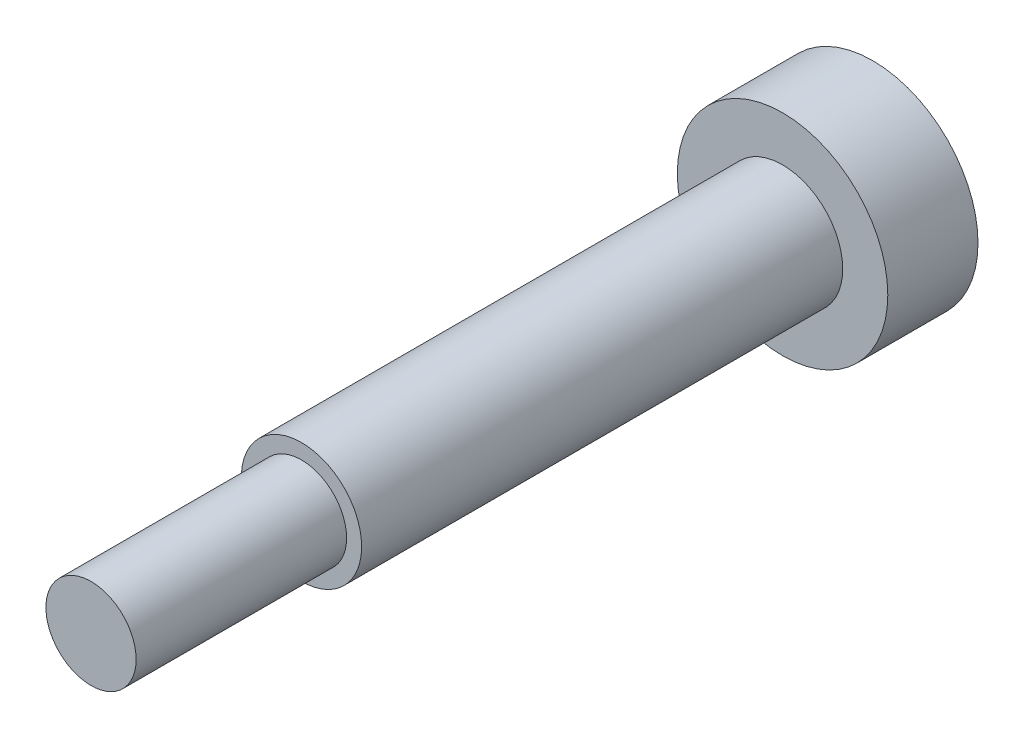
ISO-10303-21;
HEADER;
FILE_DESCRIPTION(('STEP AP214'),'2;1');
FILE_NAME('part.step','',(''),(''),'','','');
FILE_SCHEMA(('AUTOMOTIVE_DESIGN { 1 0 10303 214 1 1 1 1 }'));
ENDSEC;
DATA;
#1=APPLICATION_CONTEXT('core data for automotive mechanical design processes');
#2=APPLICATION_PROTOCOL_DEFINITION('international standard','automotive_design',2000,#1);
#3=PRODUCT_CONTEXT('',#1,'mechanical');
#4=PRODUCT('Part','Part','',(#3));
#5=PRODUCT_RELATED_PRODUCT_CATEGORY('part','',(#4));
#6=PRODUCT_DEFINITION_FORMATION('','',#4);
#7=PRODUCT_DEFINITION_CONTEXT('part definition',#1,'design');
#8=PRODUCT_DEFINITION('design','',#6,#7);
#9=PRODUCT_DEFINITION_SHAPE('','',#8);
#10=(LENGTH_UNIT() NAMED_UNIT(*) SI_UNIT(.MILLI.,.METRE.));
#11=(NAMED_UNIT(*) PLANE_ANGLE_UNIT() SI_UNIT($,.RADIAN.));
#12=(NAMED_UNIT(*) SI_UNIT($,.STERADIAN.) SOLID_ANGLE_UNIT());
#13=UNCERTAINTY_MEASURE_WITH_UNIT(LENGTH_MEASURE(1.E-05),#10,'distance_accuracy_value','');
#14=(GEOMETRIC_REPRESENTATION_CONTEXT(3) GLOBAL_UNCERTAINTY_ASSIGNED_CONTEXT((#13)) GLOBAL_UNIT_ASSIGNED_CONTEXT((#10,
#11,#12)) REPRESENTATION_CONTEXT('',''));
#15=CARTESIAN_POINT('',(0.,0.,0.));
#16=DIRECTION('',(0.,0.,1.));
#17=DIRECTION('',(1.,0.,0.));
#18=AXIS2_PLACEMENT_3D('',#15,#16,#17);
#19=CARTESIAN_POINT('',(0.,0.,-3.));
#20=DIRECTION('',(0.,0.,1.));
#21=DIRECTION('',(1.,0.,0.));
#22=AXIS2_PLACEMENT_3D('',#19,#20,#21);
#23=PLANE('',#22);
#24=CARTESIAN_POINT('',(0.,0.,-3.));
#25=DIRECTION('',(0.,0.,1.));
#26=DIRECTION('',(1.,0.,0.));
#27=AXIS2_PLACEMENT_3D('',#24,#25,#26);
#28=CIRCLE('',#27,3.5);
#29=CARTESIAN_POINT('',(3.5,0.,-3.));
#30=VERTEX_POINT('',#29);
#31=EDGE_CURVE('E122',#30,#30,#28,.T.);
#32=ORIENTED_EDGE('',*,*,#31,.F.);
#33=EDGE_LOOP('',(#32));
#34=FACE_BOUND('',#33,.T.);
#35=DIRECTION('',(-0.5,-0.866025403784439,0.));
#36=VECTOR('',#35,1.);
#37=CARTESIAN_POINT('',(0.866025403784439,-0.5,-3.));
#38=LINE('',#37,#36);
#39=CARTESIAN_POINT('',(1.15470053837925,0.,-3.));
#40=VERTEX_POINT('',#39);
#41=CARTESIAN_POINT('',(0.577350269189626,-1.,-3.));
#42=VERTEX_POINT('',#41);
#43=EDGE_CURVE('E11',#40,#42,#38,.T.);
#44=ORIENTED_EDGE('',*,*,#43,.F.);
#45=DIRECTION('',(0.5,-0.866025403784439,0.));
#46=VECTOR('',#45,1.);
#47=CARTESIAN_POINT('',(0.866025403784439,0.5,-3.));
#48=LINE('',#47,#46);
#49=CARTESIAN_POINT('',(0.577350269189626,1.,-3.));
#50=VERTEX_POINT('',#49);
#51=EDGE_CURVE('E50',#50,#40,#48,.T.);
#52=ORIENTED_EDGE('',*,*,#51,.F.);
#53=DIRECTION('',(1.,0.,0.));
#54=VECTOR('',#53,1.);
#55=CARTESIAN_POINT('',(0.,1.,-3.));
#56=LINE('',#55,#54);
#57=CARTESIAN_POINT('',(-0.577350269189626,1.,-3.));
#58=VERTEX_POINT('',#57);
#59=EDGE_CURVE('E140',#58,#50,#56,.T.);
#60=ORIENTED_EDGE('',*,*,#59,.F.);
#61=DIRECTION('',(0.5,0.866025403784438,0.));
#62=VECTOR('',#61,1.);
#63=CARTESIAN_POINT('',(-0.866025403784439,0.5,-3.));
#64=LINE('',#63,#62);
#65=CARTESIAN_POINT('',(-1.15470053837925,0.,-3.));
#66=VERTEX_POINT('',#65);
#67=EDGE_CURVE('E135',#66,#58,#64,.T.);
#68=ORIENTED_EDGE('',*,*,#67,.F.);
#69=DIRECTION('',(-0.5,0.866025403784439,0.));
#70=VECTOR('',#69,1.);
#71=CARTESIAN_POINT('',(-0.866025403784439,-0.5,-3.));
#72=LINE('',#71,#70);
#73=CARTESIAN_POINT('',(-0.577350269189626,-1.,-3.));
#74=VERTEX_POINT('',#73);
#75=EDGE_CURVE('E134',#74,#66,#72,.T.);
#76=ORIENTED_EDGE('',*,*,#75,.F.);
#77=DIRECTION('',(-1.,0.,0.));
#78=VECTOR('',#77,1.);
#79=CARTESIAN_POINT('',(0.,-1.,-3.));
#80=LINE('',#79,#78);
#81=EDGE_CURVE('E120',#42,#74,#80,.T.);
#82=ORIENTED_EDGE('',*,*,#81,.F.);
#83=EDGE_LOOP('',(#44,#52,#60,#68,#76,#82));
#84=FACE_BOUND('',#83,.T.);
#85=ADVANCED_FACE('F39',(#34,#84),#23,.F.);
#86=CARTESIAN_POINT('',(0.,0.,0.));
#87=DIRECTION('',(0.,0.,-1.));
#88=DIRECTION('',(-1.,0.,0.));
#89=AXIS2_PLACEMENT_3D('',#86,#87,#88);
#90=CYLINDRICAL_SURFACE('',#89,3.5);
#91=CARTESIAN_POINT('',(0.,0.,0.));
#92=DIRECTION('',(0.,0.,1.));
#93=DIRECTION('',(1.,0.,0.));
#94=AXIS2_PLACEMENT_3D('',#91,#92,#93);
#95=CIRCLE('',#94,3.5);
#96=CARTESIAN_POINT('',(3.5,0.,0.));
#97=VERTEX_POINT('',#96);
#98=EDGE_CURVE('E130',#97,#97,#95,.T.);
#99=ORIENTED_EDGE('',*,*,#98,.F.);
#100=EDGE_LOOP('',(#99));
#101=FACE_BOUND('',#100,.T.);
#102=ORIENTED_EDGE('',*,*,#31,.T.);
#103=EDGE_LOOP('',(#102));
#104=FACE_BOUND('',#103,.T.);
#105=ADVANCED_FACE('F41',(#101,#104),#90,.T.);
#106=CARTESIAN_POINT('',(0.,0.,0.));
#107=DIRECTION('',(0.,0.,1.));
#108=DIRECTION('',(1.,0.,0.));
#109=AXIS2_PLACEMENT_3D('',#106,#107,#108);
#110=PLANE('',#109);
#111=CARTESIAN_POINT('',(0.,0.,0.));
#112=DIRECTION('',(0.,0.,1.));
#113=DIRECTION('',(1.,0.,0.));
#114=AXIS2_PLACEMENT_3D('',#111,#112,#113);
#115=CIRCLE('',#114,2.);
#116=CARTESIAN_POINT('',(2.,0.,0.));
#117=VERTEX_POINT('',#116);
#118=EDGE_CURVE('E123',#117,#117,#115,.T.);
#119=ORIENTED_EDGE('',*,*,#118,.F.);
#120=EDGE_LOOP('',(#119));
#121=FACE_BOUND('',#120,.T.);
#122=ORIENTED_EDGE('',*,*,#98,.T.);
#123=EDGE_LOOP('',(#122));
#124=FACE_BOUND('',#123,.T.);
#125=ADVANCED_FACE('F184',(#121,#124),#110,.T.);
#126=CARTESIAN_POINT('',(0.,0.,16.));
#127=DIRECTION('',(0.,0.,-1.));
#128=DIRECTION('',(-1.,0.,0.));
#129=AXIS2_PLACEMENT_3D('',#126,#127,#128);
#130=CYLINDRICAL_SURFACE('',#129,2.);
#131=CARTESIAN_POINT('',(0.,0.,16.));
#132=DIRECTION('',(0.,0.,1.));
#133=DIRECTION('',(1.,0.,0.));
#134=AXIS2_PLACEMENT_3D('',#131,#132,#133);
#135=CIRCLE('',#134,2.);
#136=CARTESIAN_POINT('',(2.,0.,16.));
#137=VERTEX_POINT('',#136);
#138=EDGE_CURVE('E112',#137,#137,#135,.T.);
#139=ORIENTED_EDGE('',*,*,#138,.F.);
#140=EDGE_LOOP('',(#139));
#141=FACE_BOUND('',#140,.T.);
#142=ORIENTED_EDGE('',*,*,#118,.T.);
#143=EDGE_LOOP('',(#142));
#144=FACE_BOUND('',#143,.T.);
#145=ADVANCED_FACE('F190',(#141,#144),#130,.T.);
#146=CARTESIAN_POINT('',(0.,0.,16.));
#147=DIRECTION('',(0.,0.,1.));
#148=DIRECTION('',(1.,0.,0.));
#149=AXIS2_PLACEMENT_3D('',#146,#147,#148);
#150=PLANE('',#149);
#151=CARTESIAN_POINT('',(0.,0.,16.));
#152=DIRECTION('',(0.,0.,1.));
#153=DIRECTION('',(1.,0.,0.));
#154=AXIS2_PLACEMENT_3D('',#151,#152,#153);
#155=CIRCLE('',#154,1.5);
#156=CARTESIAN_POINT('',(1.5,0.,16.));
#157=VERTEX_POINT('',#156);
#158=EDGE_CURVE('E117',#157,#157,#155,.T.);
#159=ORIENTED_EDGE('',*,*,#158,.F.);
#160=EDGE_LOOP('',(#159));
#161=FACE_BOUND('',#160,.T.);
#162=ORIENTED_EDGE('',*,*,#138,.T.);
#163=EDGE_LOOP('',(#162));
#164=FACE_BOUND('',#163,.T.);
#165=ADVANCED_FACE('F192',(#161,#164),#150,.T.);
#166=CARTESIAN_POINT('',(0.,0.,23.));
#167=DIRECTION('',(0.,0.,-1.));
#168=DIRECTION('',(-1.,0.,0.));
#169=AXIS2_PLACEMENT_3D('',#166,#167,#168);
#170=CYLINDRICAL_SURFACE('',#169,1.5);
#171=CARTESIAN_POINT('',(0.,0.,23.));
#172=DIRECTION('',(0.,0.,1.));
#173=DIRECTION('',(1.,0.,0.));
#174=AXIS2_PLACEMENT_3D('',#171,#172,#173);
#175=CIRCLE('',#174,1.5);
#176=CARTESIAN_POINT('',(1.5,0.,23.));
#177=VERTEX_POINT('',#176);
#178=EDGE_CURVE('E110',#177,#177,#175,.T.);
#179=ORIENTED_EDGE('',*,*,#178,.F.);
#180=EDGE_LOOP('',(#179));
#181=FACE_BOUND('',#180,.T.);
#182=ORIENTED_EDGE('',*,*,#158,.T.);
#183=EDGE_LOOP('',(#182));
#184=FACE_BOUND('',#183,.T.);
#185=ADVANCED_FACE('F196',(#181,#184),#170,.T.);
#186=CARTESIAN_POINT('',(0.,0.,23.));
#187=DIRECTION('',(0.,0.,1.));
#188=DIRECTION('',(1.,0.,0.));
#189=AXIS2_PLACEMENT_3D('',#186,#187,#188);
#190=PLANE('',#189);
#191=ORIENTED_EDGE('',*,*,#178,.T.);
#192=EDGE_LOOP('',(#191));
#193=FACE_BOUND('',#192,.T.);
#194=ADVANCED_FACE('F205',(#193),#190,.T.);
#195=CARTESIAN_POINT('',(0.577350269189626,-1.,-0.96));
#196=DIRECTION('',(-0.866025403784439,0.5,0.));
#197=DIRECTION('',(-0.5,-0.866025403784439,0.));
#198=AXIS2_PLACEMENT_3D('',#195,#196,#197);
#199=PLANE('',#198);
#200=ORIENTED_EDGE('',*,*,#43,.T.);
#201=DIRECTION('',(0.,0.,-1.));
#202=VECTOR('',#201,1.);
#203=CARTESIAN_POINT('',(0.577350269189626,-1.,-0.96));
#204=LINE('',#203,#202);
#205=CARTESIAN_POINT('',(0.577350269189626,-1.,-0.96));
#206=VERTEX_POINT('',#205);
#207=EDGE_CURVE('E53',#206,#42,#204,.T.);
#208=ORIENTED_EDGE('',*,*,#207,.F.);
#209=DIRECTION('',(0.5,0.866025403784439,0.));
#210=VECTOR('',#209,1.);
#211=CARTESIAN_POINT('',(0.577350269189626,-1.,-0.96));
#212=LINE('',#211,#210);
#213=CARTESIAN_POINT('',(1.15470053837925,0.,-0.96));
#214=VERTEX_POINT('',#213);
#215=EDGE_CURVE('E96',#206,#214,#212,.T.);
#216=ORIENTED_EDGE('',*,*,#215,.T.);
#217=DIRECTION('',(0.,0.,-1.));
#218=VECTOR('',#217,1.);
#219=CARTESIAN_POINT('',(1.15470053837925,0.,-0.96));
#220=LINE('',#219,#218);
#221=EDGE_CURVE('E103',#214,#40,#220,.T.);
#222=ORIENTED_EDGE('',*,*,#221,.T.);
#223=EDGE_LOOP('',(#200,#208,#216,#222));
#224=FACE_BOUND('',#223,.T.);
#225=ADVANCED_FACE('F105',(#224),#199,.T.);
#226=CARTESIAN_POINT('',(1.15470053837925,0.,-0.96));
#227=DIRECTION('',(-0.866025403784439,-0.5,0.));
#228=DIRECTION('',(0.5,-0.866025403784439,0.));
#229=AXIS2_PLACEMENT_3D('',#226,#227,#228);
#230=PLANE('',#229);
#231=ORIENTED_EDGE('',*,*,#51,.T.);
#232=ORIENTED_EDGE('',*,*,#221,.F.);
#233=DIRECTION('',(-0.5,0.866025403784439,0.));
#234=VECTOR('',#233,1.);
#235=CARTESIAN_POINT('',(1.15470053837925,0.,-0.96));
#236=LINE('',#235,#234);
#237=CARTESIAN_POINT('',(0.577350269189626,1.,-0.96));
#238=VERTEX_POINT('',#237);
#239=EDGE_CURVE('E95',#214,#238,#236,.T.);
#240=ORIENTED_EDGE('',*,*,#239,.T.);
#241=DIRECTION('',(0.,0.,-1.));
#242=VECTOR('',#241,1.);
#243=CARTESIAN_POINT('',(0.577350269189626,1.,-0.96));
#244=LINE('',#243,#242);
#245=EDGE_CURVE('E107',#238,#50,#244,.T.);
#246=ORIENTED_EDGE('',*,*,#245,.T.);
#247=EDGE_LOOP('',(#231,#232,#240,#246));
#248=FACE_BOUND('',#247,.T.);
#249=ADVANCED_FACE('F106',(#248),#230,.T.);
#250=CARTESIAN_POINT('',(0.577350269189626,1.,-0.96));
#251=DIRECTION('',(0.,-1.,0.));
#252=DIRECTION('',(1.,0.,0.));
#253=AXIS2_PLACEMENT_3D('',#250,#251,#252);
#254=PLANE('',#253);
#255=ORIENTED_EDGE('',*,*,#59,.T.);
#256=ORIENTED_EDGE('',*,*,#245,.F.);
#257=DIRECTION('',(-1.,0.,0.));
#258=VECTOR('',#257,1.);
#259=CARTESIAN_POINT('',(0.577350269189626,1.,-0.96));
#260=LINE('',#259,#258);
#261=CARTESIAN_POINT('',(-0.577350269189626,1.,-0.96));
#262=VERTEX_POINT('',#261);
#263=EDGE_CURVE('E98',#238,#262,#260,.T.);
#264=ORIENTED_EDGE('',*,*,#263,.T.);
#265=DIRECTION('',(0.,0.,-1.));
#266=VECTOR('',#265,1.);
#267=CARTESIAN_POINT('',(-0.577350269189626,1.,-0.96));
#268=LINE('',#267,#266);
#269=EDGE_CURVE('E114',#262,#58,#268,.T.);
#270=ORIENTED_EDGE('',*,*,#269,.T.);
#271=EDGE_LOOP('',(#255,#256,#264,#270));
#272=FACE_BOUND('',#271,.T.);
#273=ADVANCED_FACE('F143',(#272),#254,.T.);
#274=CARTESIAN_POINT('',(-0.577350269189626,1.,-0.96));
#275=DIRECTION('',(0.866025403784438,-0.5,0.));
#276=DIRECTION('',(0.5,0.866025403784438,0.));
#277=AXIS2_PLACEMENT_3D('',#274,#275,#276);
#278=PLANE('',#277);
#279=ORIENTED_EDGE('',*,*,#67,.T.);
#280=ORIENTED_EDGE('',*,*,#269,.F.);
#281=DIRECTION('',(-0.5,-0.866025403784438,0.));
#282=VECTOR('',#281,1.);
#283=CARTESIAN_POINT('',(-0.577350269189626,1.,-0.96));
#284=LINE('',#283,#282);
#285=CARTESIAN_POINT('',(-1.15470053837925,0.,-0.96));
#286=VERTEX_POINT('',#285);
#287=EDGE_CURVE('E164',#262,#286,#284,.T.);
#288=ORIENTED_EDGE('',*,*,#287,.T.);
#289=DIRECTION('',(0.,0.,-1.));
#290=VECTOR('',#289,1.);
#291=CARTESIAN_POINT('',(-1.15470053837925,0.,-0.96));
#292=LINE('',#291,#290);
#293=EDGE_CURVE('E160',#286,#66,#292,.T.);
#294=ORIENTED_EDGE('',*,*,#293,.T.);
#295=EDGE_LOOP('',(#279,#280,#288,#294));
#296=FACE_BOUND('',#295,.T.);
#297=ADVANCED_FACE('F169',(#296),#278,.T.);
#298=CARTESIAN_POINT('',(-1.15470053837925,0.,-0.96));
#299=DIRECTION('',(0.866025403784439,0.5,0.));
#300=DIRECTION('',(-0.5,0.866025403784439,0.));
#301=AXIS2_PLACEMENT_3D('',#298,#299,#300);
#302=PLANE('',#301);
#303=ORIENTED_EDGE('',*,*,#75,.T.);
#304=ORIENTED_EDGE('',*,*,#293,.F.);
#305=DIRECTION('',(0.5,-0.866025403784439,0.));
#306=VECTOR('',#305,1.);
#307=CARTESIAN_POINT('',(-1.15470053837925,0.,-0.96));
#308=LINE('',#307,#306);
#309=CARTESIAN_POINT('',(-0.577350269189626,-1.,-0.96));
#310=VERTEX_POINT('',#309);
#311=EDGE_CURVE('E156',#286,#310,#308,.T.);
#312=ORIENTED_EDGE('',*,*,#311,.T.);
#313=DIRECTION('',(0.,0.,-1.));
#314=VECTOR('',#313,1.);
#315=CARTESIAN_POINT('',(-0.577350269189626,-1.,-0.96));
#316=LINE('',#315,#314);
#317=EDGE_CURVE('E147',#310,#74,#316,.T.);
#318=ORIENTED_EDGE('',*,*,#317,.T.);
#319=EDGE_LOOP('',(#303,#304,#312,#318));
#320=FACE_BOUND('',#319,.T.);
#321=ADVANCED_FACE('F155',(#320),#302,.T.);
#322=CARTESIAN_POINT('',(-0.577350269189626,-1.,-0.96));
#323=DIRECTION('',(0.,1.,0.));
#324=DIRECTION('',(-1.,0.,0.));
#325=AXIS2_PLACEMENT_3D('',#322,#323,#324);
#326=PLANE('',#325);
#327=ORIENTED_EDGE('',*,*,#81,.T.);
#328=ORIENTED_EDGE('',*,*,#317,.F.);
#329=DIRECTION('',(1.,0.,0.));
#330=VECTOR('',#329,1.);
#331=CARTESIAN_POINT('',(-0.577350269189626,-1.,-0.96));
#332=LINE('',#331,#330);
#333=EDGE_CURVE('E159',#310,#206,#332,.T.);
#334=ORIENTED_EDGE('',*,*,#333,.T.);
#335=ORIENTED_EDGE('',*,*,#207,.T.);
#336=EDGE_LOOP('',(#327,#328,#334,#335));
#337=FACE_BOUND('',#336,.T.);
#338=ADVANCED_FACE('F149',(#337),#326,.T.);
#339=CARTESIAN_POINT('',(0.,0.,-0.96));
#340=DIRECTION('',(0.,0.,1.));
#341=DIRECTION('',(1.,0.,0.));
#342=AXIS2_PLACEMENT_3D('',#339,#340,#341);
#343=PLANE('',#342);
#344=ORIENTED_EDGE('',*,*,#215,.F.);
#345=ORIENTED_EDGE('',*,*,#333,.F.);
#346=ORIENTED_EDGE('',*,*,#311,.F.);
#347=ORIENTED_EDGE('',*,*,#287,.F.);
#348=ORIENTED_EDGE('',*,*,#263,.F.);
#349=ORIENTED_EDGE('',*,*,#239,.F.);
#350=EDGE_LOOP('',(#344,#345,#346,#347,#348,#349));
#351=FACE_BOUND('',#350,.T.);
#352=ADVANCED_FACE('F94',(#351),#343,.F.);
#353=CLOSED_SHELL('',(#85,#105,#125,#145,#165,#185,#194,#225,#249,#273,#297,#321,#338,#352));
#354=MANIFOLD_SOLID_BREP('B2',#353);
#355=ADVANCED_BREP_SHAPE_REPRESENTATION('',(#18,#354),#14);
#356=SHAPE_DEFINITION_REPRESENTATION(#9,#355);
ENDSEC;
END-ISO-10303-21;
